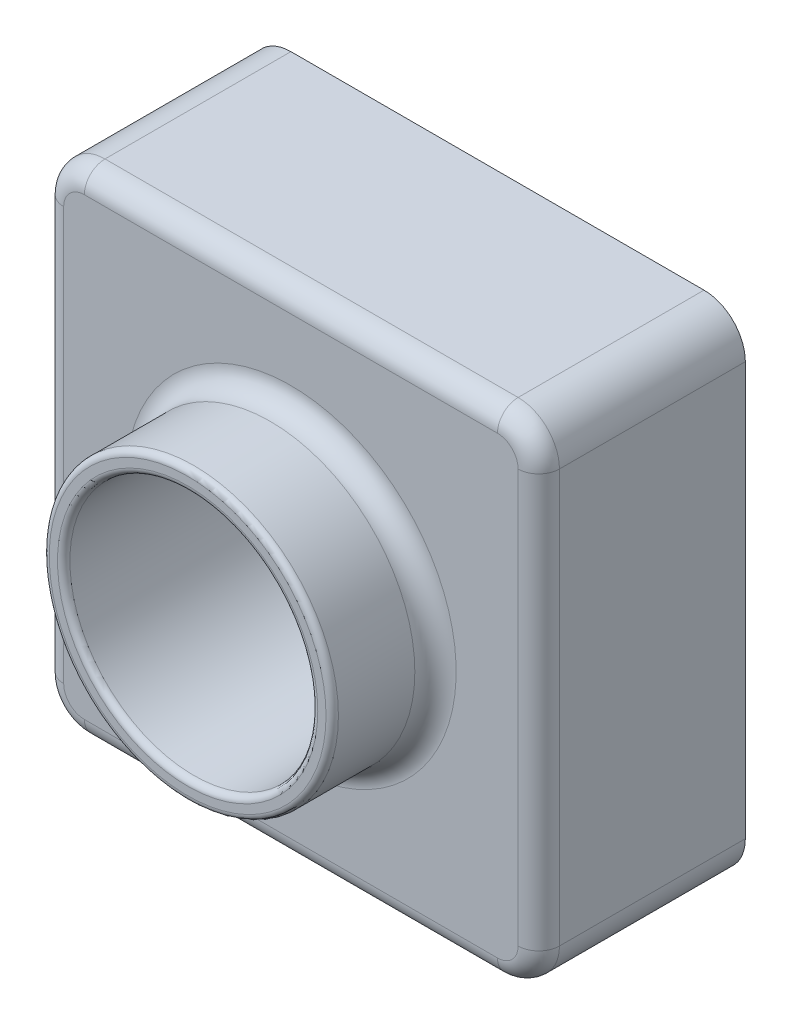
ISO-10303-21;
HEADER;
FILE_DESCRIPTION(('STEP AP214'),'2;1');
FILE_NAME('part.step','',(''),(''),'','','');
FILE_SCHEMA(('AUTOMOTIVE_DESIGN { 1 0 10303 214 1 1 1 1 }'));
ENDSEC;
DATA;
#1=APPLICATION_CONTEXT('core data for automotive mechanical design processes');
#2=APPLICATION_PROTOCOL_DEFINITION('international standard','automotive_design',2000,#1);
#3=PRODUCT_CONTEXT('',#1,'mechanical');
#4=PRODUCT('Part','Part','',(#3));
#5=PRODUCT_RELATED_PRODUCT_CATEGORY('part','',(#4));
#6=PRODUCT_DEFINITION_FORMATION('','',#4);
#7=PRODUCT_DEFINITION_CONTEXT('part definition',#1,'design');
#8=PRODUCT_DEFINITION('design','',#6,#7);
#9=PRODUCT_DEFINITION_SHAPE('','',#8);
#10=(LENGTH_UNIT() NAMED_UNIT(*) SI_UNIT(.MILLI.,.METRE.));
#11=(NAMED_UNIT(*) PLANE_ANGLE_UNIT() SI_UNIT($,.RADIAN.));
#12=(NAMED_UNIT(*) SI_UNIT($,.STERADIAN.) SOLID_ANGLE_UNIT());
#13=UNCERTAINTY_MEASURE_WITH_UNIT(LENGTH_MEASURE(1.E-05),#10,'distance_accuracy_value','');
#14=(GEOMETRIC_REPRESENTATION_CONTEXT(3) GLOBAL_UNCERTAINTY_ASSIGNED_CONTEXT((#13)) GLOBAL_UNIT_ASSIGNED_CONTEXT((#10,
#11,#12)) REPRESENTATION_CONTEXT('',''));
#15=CARTESIAN_POINT('',(0.,0.,0.));
#16=DIRECTION('',(0.,0.,1.));
#17=DIRECTION('',(1.,0.,0.));
#18=AXIS2_PLACEMENT_3D('',#15,#16,#17);
#19=CARTESIAN_POINT('',(-50.,-50.,0.));
#20=DIRECTION('',(0.,0.,-1.));
#21=DIRECTION('',(-1.,0.,0.));
#22=AXIS2_PLACEMENT_3D('',#19,#20,#21);
#23=PLANE('',#22);
#24=CARTESIAN_POINT('',(-50.,-50.,0.));
#25=DIRECTION('',(0.,0.,1.));
#26=DIRECTION('',(-1.,0.,0.));
#27=AXIS2_PLACEMENT_3D('',#24,#25,#26);
#28=CIRCLE('',#27,9.99999999999999);
#29=CARTESIAN_POINT('',(-60.,-49.9999999999999,0.));
#30=VERTEX_POINT('',#29);
#31=CARTESIAN_POINT('',(-49.9999999999999,-60.,0.));
#32=VERTEX_POINT('',#31);
#33=EDGE_CURVE('E200',#30,#32,#28,.T.);
#34=ORIENTED_EDGE('',*,*,#33,.F.);
#35=DIRECTION('',(0.,-1.,0.));
#36=VECTOR('',#35,1.);
#37=CARTESIAN_POINT('',(-60.,-49.9999999999999,0.));
#38=LINE('',#37,#36);
#39=CARTESIAN_POINT('',(-60.,49.9999999999999,0.));
#40=VERTEX_POINT('',#39);
#41=EDGE_CURVE('E267',#40,#30,#38,.T.);
#42=ORIENTED_EDGE('',*,*,#41,.F.);
#43=CARTESIAN_POINT('',(-50.,50.,0.));
#44=DIRECTION('',(0.,0.,1.));
#45=DIRECTION('',(-1.,0.,0.));
#46=AXIS2_PLACEMENT_3D('',#43,#44,#45);
#47=CIRCLE('',#46,10.);
#48=CARTESIAN_POINT('',(-49.9999999999999,60.,0.));
#49=VERTEX_POINT('',#48);
#50=EDGE_CURVE('E264',#49,#40,#47,.T.);
#51=ORIENTED_EDGE('',*,*,#50,.F.);
#52=DIRECTION('',(-1.,0.,0.));
#53=VECTOR('',#52,1.);
#54=CARTESIAN_POINT('',(-49.9999999999999,60.,0.));
#55=LINE('',#54,#53);
#56=CARTESIAN_POINT('',(49.9999999999999,60.,0.));
#57=VERTEX_POINT('',#56);
#58=EDGE_CURVE('E261',#57,#49,#55,.T.);
#59=ORIENTED_EDGE('',*,*,#58,.F.);
#60=CARTESIAN_POINT('',(50.,50.,0.));
#61=DIRECTION('',(0.,0.,1.));
#62=DIRECTION('',(-1.,0.,0.));
#63=AXIS2_PLACEMENT_3D('',#60,#61,#62);
#64=CIRCLE('',#63,10.);
#65=CARTESIAN_POINT('',(60.,49.9999999999999,0.));
#66=VERTEX_POINT('',#65);
#67=EDGE_CURVE('E258',#66,#57,#64,.T.);
#68=ORIENTED_EDGE('',*,*,#67,.F.);
#69=DIRECTION('',(0.,1.,0.));
#70=VECTOR('',#69,1.);
#71=CARTESIAN_POINT('',(60.,-49.9999999999999,0.));
#72=LINE('',#71,#70);
#73=CARTESIAN_POINT('',(60.,-50.,0.));
#74=VERTEX_POINT('',#73);
#75=EDGE_CURVE('E255',#74,#66,#72,.T.);
#76=ORIENTED_EDGE('',*,*,#75,.F.);
#77=CARTESIAN_POINT('',(50.,-50.,0.));
#78=DIRECTION('',(0.,0.,1.));
#79=DIRECTION('',(1.,0.,0.));
#80=AXIS2_PLACEMENT_3D('',#77,#78,#79);
#81=CIRCLE('',#80,9.99999999999999);
#82=CARTESIAN_POINT('',(49.9999999999999,-60.,0.));
#83=VERTEX_POINT('',#82);
#84=EDGE_CURVE('E252',#83,#74,#81,.T.);
#85=ORIENTED_EDGE('',*,*,#84,.F.);
#86=DIRECTION('',(1.,0.,0.));
#87=VECTOR('',#86,1.);
#88=CARTESIAN_POINT('',(-49.9999999999999,-60.,0.));
#89=LINE('',#88,#87);
#90=EDGE_CURVE('E204',#32,#83,#89,.T.);
#91=ORIENTED_EDGE('',*,*,#90,.F.);
#92=EDGE_LOOP('',(#34,#42,#51,#59,#68,#76,#85,#91));
#93=FACE_BOUND('',#92,.T.);
#94=DIRECTION('',(0.,-1.,0.));
#95=VECTOR('',#94,1.);
#96=CARTESIAN_POINT('',(-58.,-50.,0.));
#97=LINE('',#96,#95);
#98=CARTESIAN_POINT('',(-58.,49.9999999999999,0.));
#99=VERTEX_POINT('',#98);
#100=CARTESIAN_POINT('',(-58.,-49.9999999999999,0.));
#101=VERTEX_POINT('',#100);
#102=EDGE_CURVE('E195',#99,#101,#97,.T.);
#103=ORIENTED_EDGE('',*,*,#102,.T.);
#104=CARTESIAN_POINT('',(-50.,-50.,0.));
#105=DIRECTION('',(0.,0.,-1.));
#106=DIRECTION('',(-1.,0.,0.));
#107=AXIS2_PLACEMENT_3D('',#104,#105,#106);
#108=CIRCLE('',#107,7.99999999999999);
#109=CARTESIAN_POINT('',(-49.9999999999999,-58.,0.));
#110=VERTEX_POINT('',#109);
#111=EDGE_CURVE('E230',#101,#110,#108,.F.);
#112=ORIENTED_EDGE('',*,*,#111,.T.);
#113=DIRECTION('',(1.,0.,0.));
#114=VECTOR('',#113,1.);
#115=CARTESIAN_POINT('',(-50.,-58.,0.));
#116=LINE('',#115,#114);
#117=CARTESIAN_POINT('',(49.9999999999999,-58.,0.));
#118=VERTEX_POINT('',#117);
#119=EDGE_CURVE('E199',#110,#118,#116,.T.);
#120=ORIENTED_EDGE('',*,*,#119,.T.);
#121=CARTESIAN_POINT('',(50.,-50.,0.));
#122=DIRECTION('',(0.,0.,-1.));
#123=DIRECTION('',(-1.,0.,0.));
#124=AXIS2_PLACEMENT_3D('',#121,#122,#123);
#125=CIRCLE('',#124,7.99999999999999);
#126=CARTESIAN_POINT('',(58.,-50.,0.));
#127=VERTEX_POINT('',#126);
#128=EDGE_CURVE('E246',#118,#127,#125,.F.);
#129=ORIENTED_EDGE('',*,*,#128,.T.);
#130=DIRECTION('',(0.,1.,0.));
#131=VECTOR('',#130,1.);
#132=CARTESIAN_POINT('',(58.,-50.,0.));
#133=LINE('',#132,#131);
#134=CARTESIAN_POINT('',(58.,49.9999999999999,0.));
#135=VERTEX_POINT('',#134);
#136=EDGE_CURVE('E243',#127,#135,#133,.T.);
#137=ORIENTED_EDGE('',*,*,#136,.T.);
#138=CARTESIAN_POINT('',(50.,50.,0.));
#139=DIRECTION('',(0.,0.,-1.));
#140=DIRECTION('',(-1.,0.,0.));
#141=AXIS2_PLACEMENT_3D('',#138,#139,#140);
#142=CIRCLE('',#141,8.);
#143=CARTESIAN_POINT('',(49.9999999999999,58.,0.));
#144=VERTEX_POINT('',#143);
#145=EDGE_CURVE('E240',#135,#144,#142,.F.);
#146=ORIENTED_EDGE('',*,*,#145,.T.);
#147=DIRECTION('',(-1.,0.,0.));
#148=VECTOR('',#147,1.);
#149=CARTESIAN_POINT('',(-50.,58.,0.));
#150=LINE('',#149,#148);
#151=CARTESIAN_POINT('',(-49.9999999999999,58.,0.));
#152=VERTEX_POINT('',#151);
#153=EDGE_CURVE('E237',#144,#152,#150,.T.);
#154=ORIENTED_EDGE('',*,*,#153,.T.);
#155=CARTESIAN_POINT('',(-50.,50.,0.));
#156=DIRECTION('',(0.,0.,-1.));
#157=DIRECTION('',(-1.,0.,0.));
#158=AXIS2_PLACEMENT_3D('',#155,#156,#157);
#159=CIRCLE('',#158,8.);
#160=EDGE_CURVE('E234',#152,#99,#159,.F.);
#161=ORIENTED_EDGE('',*,*,#160,.T.);
#162=EDGE_LOOP('',(#103,#112,#120,#129,#137,#146,#154,#161));
#163=FACE_BOUND('',#162,.T.);
#164=ADVANCED_FACE('F37',(#93,#163),#23,.T.);
#165=CARTESIAN_POINT('',(-50.,-50.,50.));
#166=DIRECTION('',(0.,0.,-1.));
#167=DIRECTION('',(-1.,0.,0.));
#168=AXIS2_PLACEMENT_3D('',#165,#166,#167);
#169=CYLINDRICAL_SURFACE('',#168,9.99999999999999);
#170=DIRECTION('',(0.,0.,-1.));
#171=VECTOR('',#170,1.);
#172=CARTESIAN_POINT('',(-49.9999999999999,-60.,50.));
#173=LINE('',#172,#171);
#174=CARTESIAN_POINT('',(-49.9999999999999,-60.,45.));
#175=VERTEX_POINT('',#174);
#176=EDGE_CURVE('E284',#175,#32,#173,.T.);
#177=ORIENTED_EDGE('',*,*,#176,.F.);
#178=CARTESIAN_POINT('',(-50.,-50.,45.));
#179=DIRECTION('',(0.,0.,-1.));
#180=DIRECTION('',(-1.,0.,0.));
#181=AXIS2_PLACEMENT_3D('',#178,#179,#180);
#182=CIRCLE('',#181,9.99999999999999);
#183=CARTESIAN_POINT('',(-60.,-49.9999999999999,45.));
#184=VERTEX_POINT('',#183);
#185=EDGE_CURVE('E11',#175,#184,#182,.T.);
#186=ORIENTED_EDGE('',*,*,#185,.T.);
#187=DIRECTION('',(0.,0.,-1.));
#188=VECTOR('',#187,1.);
#189=CARTESIAN_POINT('',(-60.,-49.9999999999999,50.));
#190=LINE('',#189,#188);
#191=EDGE_CURVE('E270',#184,#30,#190,.T.);
#192=ORIENTED_EDGE('',*,*,#191,.T.);
#193=ORIENTED_EDGE('',*,*,#33,.T.);
#194=EDGE_LOOP('',(#177,#186,#192,#193));
#195=FACE_BOUND('',#194,.T.);
#196=ADVANCED_FACE('F428',(#195),#169,.T.);
#197=CARTESIAN_POINT('',(-49.9999999999999,-60.,50.));
#198=DIRECTION('',(0.,1.,0.));
#199=DIRECTION('',(0.,0.,1.));
#200=AXIS2_PLACEMENT_3D('',#197,#198,#199);
#201=PLANE('',#200);
#202=DIRECTION('',(0.,0.,-1.));
#203=VECTOR('',#202,1.);
#204=CARTESIAN_POINT('',(49.9999999999999,-60.,50.));
#205=LINE('',#204,#203);
#206=CARTESIAN_POINT('',(49.9999999999999,-60.,45.));
#207=VERTEX_POINT('',#206);
#208=EDGE_CURVE('E282',#207,#83,#205,.T.);
#209=ORIENTED_EDGE('',*,*,#208,.F.);
#210=DIRECTION('',(1.,0.,0.));
#211=VECTOR('',#210,1.);
#212=CARTESIAN_POINT('',(-49.9999999999999,-60.,45.));
#213=LINE('',#212,#211);
#214=EDGE_CURVE('E46',#207,#175,#213,.F.);
#215=ORIENTED_EDGE('',*,*,#214,.T.);
#216=ORIENTED_EDGE('',*,*,#176,.T.);
#217=ORIENTED_EDGE('',*,*,#90,.T.);
#218=EDGE_LOOP('',(#209,#215,#216,#217));
#219=FACE_BOUND('',#218,.T.);
#220=ADVANCED_FACE('F448',(#219),#201,.F.);
#221=CARTESIAN_POINT('',(50.,-50.,50.));
#222=DIRECTION('',(0.,0.,-1.));
#223=DIRECTION('',(-1.,0.,0.));
#224=AXIS2_PLACEMENT_3D('',#221,#222,#223);
#225=CYLINDRICAL_SURFACE('',#224,9.99999999999999);
#226=DIRECTION('',(0.,0.,-1.));
#227=VECTOR('',#226,1.);
#228=CARTESIAN_POINT('',(60.,-50.,50.));
#229=LINE('',#228,#227);
#230=CARTESIAN_POINT('',(60.,-50.,45.));
#231=VERTEX_POINT('',#230);
#232=EDGE_CURVE('E280',#231,#74,#229,.T.);
#233=ORIENTED_EDGE('',*,*,#232,.F.);
#234=CARTESIAN_POINT('',(50.,-50.,45.));
#235=DIRECTION('',(0.,0.,-1.));
#236=DIRECTION('',(-1.,0.,0.));
#237=AXIS2_PLACEMENT_3D('',#234,#235,#236);
#238=CIRCLE('',#237,9.99999999999999);
#239=EDGE_CURVE('E61',#231,#207,#238,.T.);
#240=ORIENTED_EDGE('',*,*,#239,.T.);
#241=ORIENTED_EDGE('',*,*,#208,.T.);
#242=ORIENTED_EDGE('',*,*,#84,.T.);
#243=EDGE_LOOP('',(#233,#240,#241,#242));
#244=FACE_BOUND('',#243,.T.);
#245=ADVANCED_FACE('F385',(#244),#225,.T.);
#246=CARTESIAN_POINT('',(60.,-49.9999999999999,50.));
#247=DIRECTION('',(-1.,0.,0.));
#248=DIRECTION('',(0.,0.,1.));
#249=AXIS2_PLACEMENT_3D('',#246,#247,#248);
#250=PLANE('',#249);
#251=DIRECTION('',(0.,0.,-1.));
#252=VECTOR('',#251,1.);
#253=CARTESIAN_POINT('',(60.,49.9999999999999,50.));
#254=LINE('',#253,#252);
#255=CARTESIAN_POINT('',(60.,49.9999999999999,45.));
#256=VERTEX_POINT('',#255);
#257=EDGE_CURVE('E278',#256,#66,#254,.T.);
#258=ORIENTED_EDGE('',*,*,#257,.F.);
#259=DIRECTION('',(0.,1.,0.));
#260=VECTOR('',#259,1.);
#261=CARTESIAN_POINT('',(60.,-49.9999999999999,45.));
#262=LINE('',#261,#260);
#263=EDGE_CURVE('E348',#256,#231,#262,.F.);
#264=ORIENTED_EDGE('',*,*,#263,.T.);
#265=ORIENTED_EDGE('',*,*,#232,.T.);
#266=ORIENTED_EDGE('',*,*,#75,.T.);
#267=EDGE_LOOP('',(#258,#264,#265,#266));
#268=FACE_BOUND('',#267,.T.);
#269=ADVANCED_FACE('F384',(#268),#250,.F.);
#270=CARTESIAN_POINT('',(50.,50.,50.));
#271=DIRECTION('',(0.,0.,-1.));
#272=DIRECTION('',(-1.,0.,0.));
#273=AXIS2_PLACEMENT_3D('',#270,#271,#272);
#274=CYLINDRICAL_SURFACE('',#273,10.);
#275=DIRECTION('',(0.,0.,-1.));
#276=VECTOR('',#275,1.);
#277=CARTESIAN_POINT('',(49.9999999999999,60.,50.));
#278=LINE('',#277,#276);
#279=CARTESIAN_POINT('',(49.9999999999999,60.,45.));
#280=VERTEX_POINT('',#279);
#281=EDGE_CURVE('E276',#280,#57,#278,.T.);
#282=ORIENTED_EDGE('',*,*,#281,.F.);
#283=CARTESIAN_POINT('',(50.,50.,45.));
#284=DIRECTION('',(0.,0.,-1.));
#285=DIRECTION('',(-1.,0.,0.));
#286=AXIS2_PLACEMENT_3D('',#283,#284,#285);
#287=CIRCLE('',#286,10.);
#288=EDGE_CURVE('E346',#280,#256,#287,.T.);
#289=ORIENTED_EDGE('',*,*,#288,.T.);
#290=ORIENTED_EDGE('',*,*,#257,.T.);
#291=ORIENTED_EDGE('',*,*,#67,.T.);
#292=EDGE_LOOP('',(#282,#289,#290,#291));
#293=FACE_BOUND('',#292,.T.);
#294=ADVANCED_FACE('F397',(#293),#274,.T.);
#295=CARTESIAN_POINT('',(-49.9999999999999,60.,50.));
#296=DIRECTION('',(0.,-1.,0.));
#297=DIRECTION('',(0.,0.,-1.));
#298=AXIS2_PLACEMENT_3D('',#295,#296,#297);
#299=PLANE('',#298);
#300=DIRECTION('',(0.,0.,-1.));
#301=VECTOR('',#300,1.);
#302=CARTESIAN_POINT('',(-49.9999999999999,60.,50.));
#303=LINE('',#302,#301);
#304=CARTESIAN_POINT('',(-49.9999999999999,60.,45.));
#305=VERTEX_POINT('',#304);
#306=EDGE_CURVE('E274',#305,#49,#303,.T.);
#307=ORIENTED_EDGE('',*,*,#306,.F.);
#308=DIRECTION('',(-1.,0.,0.));
#309=VECTOR('',#308,1.);
#310=CARTESIAN_POINT('',(-49.9999999999999,60.,45.));
#311=LINE('',#310,#309);
#312=EDGE_CURVE('E344',#305,#280,#311,.F.);
#313=ORIENTED_EDGE('',*,*,#312,.T.);
#314=ORIENTED_EDGE('',*,*,#281,.T.);
#315=ORIENTED_EDGE('',*,*,#58,.T.);
#316=EDGE_LOOP('',(#307,#313,#314,#315));
#317=FACE_BOUND('',#316,.T.);
#318=ADVANCED_FACE('F400',(#317),#299,.F.);
#319=CARTESIAN_POINT('',(-50.,50.,50.));
#320=DIRECTION('',(0.,0.,-1.));
#321=DIRECTION('',(-1.,0.,0.));
#322=AXIS2_PLACEMENT_3D('',#319,#320,#321);
#323=CYLINDRICAL_SURFACE('',#322,10.);
#324=DIRECTION('',(0.,0.,-1.));
#325=VECTOR('',#324,1.);
#326=CARTESIAN_POINT('',(-60.,49.9999999999999,50.));
#327=LINE('',#326,#325);
#328=CARTESIAN_POINT('',(-60.,49.9999999999999,45.));
#329=VERTEX_POINT('',#328);
#330=EDGE_CURVE('E272',#329,#40,#327,.T.);
#331=ORIENTED_EDGE('',*,*,#330,.F.);
#332=CARTESIAN_POINT('',(-50.,50.,45.));
#333=DIRECTION('',(0.,0.,-1.));
#334=DIRECTION('',(-1.,0.,0.));
#335=AXIS2_PLACEMENT_3D('',#332,#333,#334);
#336=CIRCLE('',#335,10.);
#337=EDGE_CURVE('E342',#329,#305,#336,.T.);
#338=ORIENTED_EDGE('',*,*,#337,.T.);
#339=ORIENTED_EDGE('',*,*,#306,.T.);
#340=ORIENTED_EDGE('',*,*,#50,.T.);
#341=EDGE_LOOP('',(#331,#338,#339,#340));
#342=FACE_BOUND('',#341,.T.);
#343=ADVANCED_FACE('F455',(#342),#323,.T.);
#344=CARTESIAN_POINT('',(-60.,-49.9999999999999,50.));
#345=DIRECTION('',(1.,0.,0.));
#346=DIRECTION('',(0.,0.,-1.));
#347=AXIS2_PLACEMENT_3D('',#344,#345,#346);
#348=PLANE('',#347);
#349=ORIENTED_EDGE('',*,*,#191,.F.);
#350=DIRECTION('',(0.,-1.,0.));
#351=VECTOR('',#350,1.);
#352=CARTESIAN_POINT('',(-60.,-49.9999999999999,45.));
#353=LINE('',#352,#351);
#354=EDGE_CURVE('E339',#184,#329,#353,.F.);
#355=ORIENTED_EDGE('',*,*,#354,.T.);
#356=ORIENTED_EDGE('',*,*,#330,.T.);
#357=ORIENTED_EDGE('',*,*,#41,.T.);
#358=EDGE_LOOP('',(#349,#355,#356,#357));
#359=FACE_BOUND('',#358,.T.);
#360=ADVANCED_FACE('F431',(#359),#348,.F.);
#361=CARTESIAN_POINT('',(-50.,-50.,50.));
#362=DIRECTION('',(0.,0.,-1.));
#363=DIRECTION('',(-1.,0.,0.));
#364=AXIS2_PLACEMENT_3D('',#361,#362,#363);
#365=PLANE('',#364);
#366=CARTESIAN_POINT('',(-50.,50.,50.));
#367=DIRECTION('',(0.,0.,-1.));
#368=DIRECTION('',(-1.,0.,0.));
#369=AXIS2_PLACEMENT_3D('',#366,#367,#368);
#370=CIRCLE('',#369,5.);
#371=CARTESIAN_POINT('',(-50.,55.,50.));
#372=VERTEX_POINT('',#371);
#373=CARTESIAN_POINT('',(-55.,49.9999999999999,50.));
#374=VERTEX_POINT('',#373);
#375=EDGE_CURVE('E334',#372,#374,#370,.F.);
#376=ORIENTED_EDGE('',*,*,#375,.T.);
#377=DIRECTION('',(0.,-1.,0.));
#378=VECTOR('',#377,1.);
#379=CARTESIAN_POINT('',(-55.,-50.,50.));
#380=LINE('',#379,#378);
#381=CARTESIAN_POINT('',(-55.,-49.9999999999999,50.));
#382=VERTEX_POINT('',#381);
#383=EDGE_CURVE('E336',#374,#382,#380,.T.);
#384=ORIENTED_EDGE('',*,*,#383,.T.);
#385=CARTESIAN_POINT('',(-50.,-50.,50.));
#386=DIRECTION('',(0.,0.,-1.));
#387=DIRECTION('',(-1.,0.,0.));
#388=AXIS2_PLACEMENT_3D('',#385,#386,#387);
#389=CIRCLE('',#388,4.99999999999999);
#390=CARTESIAN_POINT('',(-49.9999999999999,-55.,50.));
#391=VERTEX_POINT('',#390);
#392=EDGE_CURVE('E322',#382,#391,#389,.F.);
#393=ORIENTED_EDGE('',*,*,#392,.T.);
#394=DIRECTION('',(1.,0.,0.));
#395=VECTOR('',#394,1.);
#396=CARTESIAN_POINT('',(-50.,-55.,50.));
#397=LINE('',#396,#395);
#398=CARTESIAN_POINT('',(50.,-55.,50.));
#399=VERTEX_POINT('',#398);
#400=EDGE_CURVE('E324',#391,#399,#397,.T.);
#401=ORIENTED_EDGE('',*,*,#400,.T.);
#402=CARTESIAN_POINT('',(50.,-50.,50.));
#403=DIRECTION('',(0.,0.,-1.));
#404=DIRECTION('',(-1.,0.,0.));
#405=AXIS2_PLACEMENT_3D('',#402,#403,#404);
#406=CIRCLE('',#405,4.99999999999999);
#407=CARTESIAN_POINT('',(55.,-50.,50.));
#408=VERTEX_POINT('',#407);
#409=EDGE_CURVE('E326',#399,#408,#406,.F.);
#410=ORIENTED_EDGE('',*,*,#409,.T.);
#411=DIRECTION('',(0.,1.,0.));
#412=VECTOR('',#411,1.);
#413=CARTESIAN_POINT('',(55.,-50.,50.));
#414=LINE('',#413,#412);
#415=CARTESIAN_POINT('',(55.,50.,50.));
#416=VERTEX_POINT('',#415);
#417=EDGE_CURVE('E328',#408,#416,#414,.T.);
#418=ORIENTED_EDGE('',*,*,#417,.T.);
#419=CARTESIAN_POINT('',(50.,50.,50.));
#420=DIRECTION('',(0.,0.,-1.));
#421=DIRECTION('',(-1.,0.,0.));
#422=AXIS2_PLACEMENT_3D('',#419,#420,#421);
#423=CIRCLE('',#422,5.);
#424=CARTESIAN_POINT('',(49.9999999999999,55.,50.));
#425=VERTEX_POINT('',#424);
#426=EDGE_CURVE('E330',#416,#425,#423,.F.);
#427=ORIENTED_EDGE('',*,*,#426,.T.);
#428=DIRECTION('',(-1.,0.,0.));
#429=VECTOR('',#428,1.);
#430=CARTESIAN_POINT('',(-50.,55.,50.));
#431=LINE('',#430,#429);
#432=EDGE_CURVE('E332',#425,#372,#431,.T.);
#433=ORIENTED_EDGE('',*,*,#432,.T.);
#434=EDGE_LOOP('',(#376,#384,#393,#401,#410,#418,#427,#433));
#435=FACE_BOUND('',#434,.T.);
#436=CARTESIAN_POINT('',(0.,0.,50.));
#437=DIRECTION('',(0.,0.,-1.));
#438=DIRECTION('',(-1.,0.,0.));
#439=AXIS2_PLACEMENT_3D('',#436,#437,#438);
#440=CIRCLE('',#439,40.);
#441=CARTESIAN_POINT('',(-40.,0.,50.));
#442=VERTEX_POINT('',#441);
#443=EDGE_CURVE('E316',#442,#442,#440,.T.);
#444=ORIENTED_EDGE('',*,*,#443,.T.);
#445=EDGE_LOOP('',(#444));
#446=FACE_BOUND('',#445,.T.);
#447=ADVANCED_FACE('F413',(#435,#446),#365,.F.);
#448=CARTESIAN_POINT('',(-50.,-50.,50.));
#449=DIRECTION('',(0.,0.,-1.));
#450=DIRECTION('',(-1.,0.,0.));
#451=AXIS2_PLACEMENT_3D('',#448,#449,#450);
#452=CYLINDRICAL_SURFACE('',#451,7.99999999999999);
#453=ORIENTED_EDGE('',*,*,#111,.F.);
#454=DIRECTION('',(0.,0.,-1.));
#455=VECTOR('',#454,1.);
#456=CARTESIAN_POINT('',(-58.,-49.9999999999999,50.));
#457=LINE('',#456,#455);
#458=CARTESIAN_POINT('',(-58.,-49.9999999999999,48.));
#459=VERTEX_POINT('',#458);
#460=EDGE_CURVE('E194',#459,#101,#457,.T.);
#461=ORIENTED_EDGE('',*,*,#460,.F.);
#462=CARTESIAN_POINT('',(-50.,-50.,48.));
#463=DIRECTION('',(0.,0.,-1.));
#464=DIRECTION('',(-1.,0.,0.));
#465=AXIS2_PLACEMENT_3D('',#462,#463,#464);
#466=CIRCLE('',#465,7.99999999999999);
#467=CARTESIAN_POINT('',(-49.9999999999999,-58.,48.));
#468=VERTEX_POINT('',#467);
#469=EDGE_CURVE('E179',#459,#468,#466,.F.);
#470=ORIENTED_EDGE('',*,*,#469,.T.);
#471=DIRECTION('',(0.,0.,1.));
#472=VECTOR('',#471,1.);
#473=CARTESIAN_POINT('',(-49.9999999999999,-58.,50.));
#474=LINE('',#473,#472);
#475=EDGE_CURVE('E192',#468,#110,#474,.F.);
#476=ORIENTED_EDGE('',*,*,#475,.T.);
#477=EDGE_LOOP('',(#453,#461,#470,#476));
#478=FACE_BOUND('',#477,.T.);
#479=ADVANCED_FACE('F191',(#478),#452,.F.);
#480=CARTESIAN_POINT('',(-49.9999999999999,-58.,50.));
#481=DIRECTION('',(0.,1.,0.));
#482=DIRECTION('',(0.,0.,1.));
#483=AXIS2_PLACEMENT_3D('',#480,#481,#482);
#484=PLANE('',#483);
#485=ORIENTED_EDGE('',*,*,#119,.F.);
#486=ORIENTED_EDGE('',*,*,#475,.F.);
#487=DIRECTION('',(1.,0.,0.));
#488=VECTOR('',#487,1.);
#489=CARTESIAN_POINT('',(-50.,-58.,48.));
#490=LINE('',#489,#488);
#491=CARTESIAN_POINT('',(50.,-58.,48.));
#492=VERTEX_POINT('',#491);
#493=EDGE_CURVE('E175',#468,#492,#490,.T.);
#494=ORIENTED_EDGE('',*,*,#493,.T.);
#495=DIRECTION('',(0.,0.,-1.));
#496=VECTOR('',#495,1.);
#497=CARTESIAN_POINT('',(50.,-58.,50.));
#498=LINE('',#497,#496);
#499=EDGE_CURVE('E201',#492,#118,#498,.T.);
#500=ORIENTED_EDGE('',*,*,#499,.T.);
#501=EDGE_LOOP('',(#485,#486,#494,#500));
#502=FACE_BOUND('',#501,.T.);
#503=ADVANCED_FACE('F197',(#502),#484,.T.);
#504=CARTESIAN_POINT('',(50.,-50.,50.));
#505=DIRECTION('',(0.,0.,-1.));
#506=DIRECTION('',(-1.,0.,0.));
#507=AXIS2_PLACEMENT_3D('',#504,#505,#506);
#508=CYLINDRICAL_SURFACE('',#507,7.99999999999999);
#509=ORIENTED_EDGE('',*,*,#128,.F.);
#510=ORIENTED_EDGE('',*,*,#499,.F.);
#511=CARTESIAN_POINT('',(50.,-50.,48.));
#512=DIRECTION('',(0.,0.,-1.));
#513=DIRECTION('',(-1.,0.,0.));
#514=AXIS2_PLACEMENT_3D('',#511,#512,#513);
#515=CIRCLE('',#514,7.99999999999999);
#516=CARTESIAN_POINT('',(58.,-50.,48.));
#517=VERTEX_POINT('',#516);
#518=EDGE_CURVE('E181',#492,#517,#515,.F.);
#519=ORIENTED_EDGE('',*,*,#518,.T.);
#520=DIRECTION('',(0.,0.,1.));
#521=VECTOR('',#520,1.);
#522=CARTESIAN_POINT('',(58.,-50.,50.));
#523=LINE('',#522,#521);
#524=EDGE_CURVE('E206',#517,#127,#523,.F.);
#525=ORIENTED_EDGE('',*,*,#524,.T.);
#526=EDGE_LOOP('',(#509,#510,#519,#525));
#527=FACE_BOUND('',#526,.T.);
#528=ADVANCED_FACE('F506',(#527),#508,.F.);
#529=CARTESIAN_POINT('',(58.,-49.9999999999999,50.));
#530=DIRECTION('',(-1.,0.,0.));
#531=DIRECTION('',(0.,0.,1.));
#532=AXIS2_PLACEMENT_3D('',#529,#530,#531);
#533=PLANE('',#532);
#534=ORIENTED_EDGE('',*,*,#136,.F.);
#535=ORIENTED_EDGE('',*,*,#524,.F.);
#536=DIRECTION('',(0.,1.,0.));
#537=VECTOR('',#536,1.);
#538=CARTESIAN_POINT('',(58.,-50.,48.));
#539=LINE('',#538,#537);
#540=CARTESIAN_POINT('',(58.,49.9999999999999,48.));
#541=VERTEX_POINT('',#540);
#542=EDGE_CURVE('E215',#517,#541,#539,.T.);
#543=ORIENTED_EDGE('',*,*,#542,.T.);
#544=DIRECTION('',(0.,0.,-1.));
#545=VECTOR('',#544,1.);
#546=CARTESIAN_POINT('',(58.,49.9999999999999,50.));
#547=LINE('',#546,#545);
#548=EDGE_CURVE('E213',#541,#135,#547,.T.);
#549=ORIENTED_EDGE('',*,*,#548,.T.);
#550=EDGE_LOOP('',(#534,#535,#543,#549));
#551=FACE_BOUND('',#550,.T.);
#552=ADVANCED_FACE('F514',(#551),#533,.T.);
#553=CARTESIAN_POINT('',(50.,50.,50.));
#554=DIRECTION('',(0.,0.,-1.));
#555=DIRECTION('',(-1.,0.,0.));
#556=AXIS2_PLACEMENT_3D('',#553,#554,#555);
#557=CYLINDRICAL_SURFACE('',#556,8.);
#558=ORIENTED_EDGE('',*,*,#145,.F.);
#559=ORIENTED_EDGE('',*,*,#548,.F.);
#560=CARTESIAN_POINT('',(50.,50.,48.));
#561=DIRECTION('',(0.,0.,-1.));
#562=DIRECTION('',(-1.,0.,0.));
#563=AXIS2_PLACEMENT_3D('',#560,#561,#562);
#564=CIRCLE('',#563,8.);
#565=CARTESIAN_POINT('',(49.9999999999999,58.,48.));
#566=VERTEX_POINT('',#565);
#567=EDGE_CURVE('E219',#541,#566,#564,.F.);
#568=ORIENTED_EDGE('',*,*,#567,.T.);
#569=DIRECTION('',(0.,0.,-1.));
#570=VECTOR('',#569,1.);
#571=CARTESIAN_POINT('',(49.9999999999999,58.,50.));
#572=LINE('',#571,#570);
#573=EDGE_CURVE('E217',#566,#144,#572,.T.);
#574=ORIENTED_EDGE('',*,*,#573,.T.);
#575=EDGE_LOOP('',(#558,#559,#568,#574));
#576=FACE_BOUND('',#575,.T.);
#577=ADVANCED_FACE('F518',(#576),#557,.F.);
#578=CARTESIAN_POINT('',(-49.9999999999999,58.,50.));
#579=DIRECTION('',(0.,-1.,0.));
#580=DIRECTION('',(0.,0.,-1.));
#581=AXIS2_PLACEMENT_3D('',#578,#579,#580);
#582=PLANE('',#581);
#583=ORIENTED_EDGE('',*,*,#153,.F.);
#584=ORIENTED_EDGE('',*,*,#573,.F.);
#585=DIRECTION('',(-1.,0.,0.));
#586=VECTOR('',#585,1.);
#587=CARTESIAN_POINT('',(-50.,58.,48.));
#588=LINE('',#587,#586);
#589=CARTESIAN_POINT('',(-49.9999999999999,58.,48.));
#590=VERTEX_POINT('',#589);
#591=EDGE_CURVE('E223',#566,#590,#588,.T.);
#592=ORIENTED_EDGE('',*,*,#591,.T.);
#593=DIRECTION('',(0.,0.,-1.));
#594=VECTOR('',#593,1.);
#595=CARTESIAN_POINT('',(-49.9999999999999,58.,50.));
#596=LINE('',#595,#594);
#597=EDGE_CURVE('E221',#590,#152,#596,.T.);
#598=ORIENTED_EDGE('',*,*,#597,.T.);
#599=EDGE_LOOP('',(#583,#584,#592,#598));
#600=FACE_BOUND('',#599,.T.);
#601=ADVANCED_FACE('F522',(#600),#582,.T.);
#602=CARTESIAN_POINT('',(-50.,50.,50.));
#603=DIRECTION('',(0.,0.,-1.));
#604=DIRECTION('',(-1.,0.,0.));
#605=AXIS2_PLACEMENT_3D('',#602,#603,#604);
#606=CYLINDRICAL_SURFACE('',#605,8.);
#607=ORIENTED_EDGE('',*,*,#160,.F.);
#608=ORIENTED_EDGE('',*,*,#597,.F.);
#609=CARTESIAN_POINT('',(-50.,50.,48.));
#610=DIRECTION('',(0.,0.,-1.));
#611=DIRECTION('',(-1.,0.,0.));
#612=AXIS2_PLACEMENT_3D('',#609,#610,#611);
#613=CIRCLE('',#612,8.);
#614=CARTESIAN_POINT('',(-58.,49.9999999999999,48.));
#615=VERTEX_POINT('',#614);
#616=EDGE_CURVE('E226',#590,#615,#613,.F.);
#617=ORIENTED_EDGE('',*,*,#616,.T.);
#618=DIRECTION('',(0.,0.,-1.));
#619=VECTOR('',#618,1.);
#620=CARTESIAN_POINT('',(-58.,49.9999999999999,50.));
#621=LINE('',#620,#619);
#622=EDGE_CURVE('E209',#615,#99,#621,.T.);
#623=ORIENTED_EDGE('',*,*,#622,.T.);
#624=EDGE_LOOP('',(#607,#608,#617,#623));
#625=FACE_BOUND('',#624,.T.);
#626=ADVANCED_FACE('F526',(#625),#606,.F.);
#627=CARTESIAN_POINT('',(-58.,-49.9999999999999,50.));
#628=DIRECTION('',(1.,0.,0.));
#629=DIRECTION('',(0.,0.,-1.));
#630=AXIS2_PLACEMENT_3D('',#627,#628,#629);
#631=PLANE('',#630);
#632=ORIENTED_EDGE('',*,*,#102,.F.);
#633=ORIENTED_EDGE('',*,*,#622,.F.);
#634=DIRECTION('',(0.,-1.,0.));
#635=VECTOR('',#634,1.);
#636=CARTESIAN_POINT('',(-58.,-50.,48.));
#637=LINE('',#636,#635);
#638=EDGE_CURVE('E210',#615,#459,#637,.T.);
#639=ORIENTED_EDGE('',*,*,#638,.T.);
#640=ORIENTED_EDGE('',*,*,#460,.T.);
#641=EDGE_LOOP('',(#632,#633,#639,#640));
#642=FACE_BOUND('',#641,.T.);
#643=ADVANCED_FACE('F530',(#642),#631,.T.);
#644=CARTESIAN_POINT('',(-50.,-50.,48.));
#645=DIRECTION('',(0.,0.,-1.));
#646=DIRECTION('',(-1.,0.,0.));
#647=AXIS2_PLACEMENT_3D('',#644,#645,#646);
#648=PLANE('',#647);
#649=CARTESIAN_POINT('',(0.,0.,48.));
#650=DIRECTION('',(0.,0.,-1.));
#651=DIRECTION('',(-1.,0.,0.));
#652=AXIS2_PLACEMENT_3D('',#649,#650,#651);
#653=CIRCLE('',#652,40.);
#654=CARTESIAN_POINT('',(-40.,0.,48.));
#655=VERTEX_POINT('',#654);
#656=EDGE_CURVE('E313',#655,#655,#653,.F.);
#657=ORIENTED_EDGE('',*,*,#656,.T.);
#658=EDGE_LOOP('',(#657));
#659=FACE_BOUND('',#658,.T.);
#660=ORIENTED_EDGE('',*,*,#469,.F.);
#661=ORIENTED_EDGE('',*,*,#638,.F.);
#662=ORIENTED_EDGE('',*,*,#616,.F.);
#663=ORIENTED_EDGE('',*,*,#591,.F.);
#664=ORIENTED_EDGE('',*,*,#567,.F.);
#665=ORIENTED_EDGE('',*,*,#542,.F.);
#666=ORIENTED_EDGE('',*,*,#518,.F.);
#667=ORIENTED_EDGE('',*,*,#493,.F.);
#668=EDGE_LOOP('',(#660,#661,#662,#663,#664,#665,#666,#667));
#669=FACE_BOUND('',#668,.T.);
#670=ADVANCED_FACE('F177',(#659,#669),#648,.T.);
#671=CARTESIAN_POINT('',(0.,0.,0.));
#672=DIRECTION('',(0.,0.,1.));
#673=DIRECTION('',(1.,0.,0.));
#674=AXIS2_PLACEMENT_3D('',#671,#672,#673);
#675=CYLINDRICAL_SURFACE('',#674,35.);
#676=CARTESIAN_POINT('',(0.,0.,43.));
#677=DIRECTION('',(0.,0.,-1.));
#678=DIRECTION('',(-1.,0.,0.));
#679=AXIS2_PLACEMENT_3D('',#676,#677,#678);
#680=CIRCLE('',#679,35.);
#681=CARTESIAN_POINT('',(-35.,0.,43.));
#682=VERTEX_POINT('',#681);
#683=EDGE_CURVE('E310',#682,#682,#680,.T.);
#684=ORIENTED_EDGE('',*,*,#683,.T.);
#685=EDGE_LOOP('',(#684));
#686=FACE_BOUND('',#685,.T.);
#687=CARTESIAN_POINT('',(0.,0.,1.5));
#688=DIRECTION('',(0.,0.,1.));
#689=DIRECTION('',(1.,0.,0.));
#690=AXIS2_PLACEMENT_3D('',#687,#688,#689);
#691=CIRCLE('',#690,35.);
#692=CARTESIAN_POINT('',(35.,0.,1.5));
#693=VERTEX_POINT('',#692);
#694=EDGE_CURVE('E286',#693,#693,#691,.T.);
#695=ORIENTED_EDGE('',*,*,#694,.T.);
#696=EDGE_LOOP('',(#695));
#697=FACE_BOUND('',#696,.T.);
#698=ADVANCED_FACE('F509',(#686,#697),#675,.T.);
#699=CARTESIAN_POINT('',(0.,0.,0.));
#700=DIRECTION('',(0.,0.,1.));
#701=DIRECTION('',(1.,0.,0.));
#702=AXIS2_PLACEMENT_3D('',#699,#700,#701);
#703=PLANE('',#702);
#704=CARTESIAN_POINT('',(0.,0.,0.));
#705=DIRECTION('',(0.,0.,1.));
#706=DIRECTION('',(1.,0.,0.));
#707=AXIS2_PLACEMENT_3D('',#704,#705,#706);
#708=CIRCLE('',#707,33.5);
#709=CARTESIAN_POINT('',(33.5,0.,0.));
#710=VERTEX_POINT('',#709);
#711=EDGE_CURVE('E292',#710,#710,#708,.F.);
#712=ORIENTED_EDGE('',*,*,#711,.T.);
#713=EDGE_LOOP('',(#712));
#714=FACE_BOUND('',#713,.T.);
#715=CARTESIAN_POINT('',(0.,0.,0.));
#716=DIRECTION('',(0.,0.,1.));
#717=DIRECTION('',(1.,0.,0.));
#718=AXIS2_PLACEMENT_3D('',#715,#716,#717);
#719=CIRCLE('',#718,31.5);
#720=CARTESIAN_POINT('',(31.5,0.,0.));
#721=VERTEX_POINT('',#720);
#722=EDGE_CURVE('E289',#721,#721,#719,.T.);
#723=ORIENTED_EDGE('',*,*,#722,.T.);
#724=EDGE_LOOP('',(#723));
#725=FACE_BOUND('',#724,.T.);
#726=ADVANCED_FACE('F539',(#714,#725),#703,.F.);
#727=CARTESIAN_POINT('',(0.,0.,55.));
#728=DIRECTION('',(0.,0.,-1.));
#729=DIRECTION('',(-1.,0.,0.));
#730=AXIS2_PLACEMENT_3D('',#727,#728,#729);
#731=CIRCLE('',#730,35.);
#732=CARTESIAN_POINT('',(-35.,0.,55.));
#733=VERTEX_POINT('',#732);
#734=EDGE_CURVE('E319',#733,#733,#731,.F.);
#735=ORIENTED_EDGE('',*,*,#734,.T.);
#736=EDGE_LOOP('',(#735));
#737=FACE_BOUND('',#736,.T.);
#738=CARTESIAN_POINT('',(0.,0.,73.5));
#739=DIRECTION('',(0.,0.,1.));
#740=DIRECTION('',(1.,0.,0.));
#741=AXIS2_PLACEMENT_3D('',#738,#739,#740);
#742=CIRCLE('',#741,35.);
#743=CARTESIAN_POINT('',(35.,0.,73.5));
#744=VERTEX_POINT('',#743);
#745=EDGE_CURVE('E307',#744,#744,#742,.F.);
#746=ORIENTED_EDGE('',*,*,#745,.T.);
#747=EDGE_LOOP('',(#746));
#748=FACE_BOUND('',#747,.T.);
#749=ADVANCED_FACE('F541',(#737,#748),#675,.T.);
#750=CARTESIAN_POINT('',(0.,0.,0.));
#751=DIRECTION('',(0.,0.,1.));
#752=DIRECTION('',(1.,0.,0.));
#753=AXIS2_PLACEMENT_3D('',#750,#751,#752);
#754=CYLINDRICAL_SURFACE('',#753,30.);
#755=CARTESIAN_POINT('',(0.,0.,1.5));
#756=DIRECTION('',(0.,0.,1.));
#757=DIRECTION('',(1.,0.,0.));
#758=AXIS2_PLACEMENT_3D('',#755,#756,#757);
#759=CIRCLE('',#758,30.);
#760=CARTESIAN_POINT('',(30.,0.,1.5));
#761=VERTEX_POINT('',#760);
#762=EDGE_CURVE('E298',#761,#761,#759,.F.);
#763=ORIENTED_EDGE('',*,*,#762,.T.);
#764=EDGE_LOOP('',(#763));
#765=FACE_BOUND('',#764,.T.);
#766=CARTESIAN_POINT('',(0.,0.,73.5));
#767=DIRECTION('',(0.,0.,1.));
#768=DIRECTION('',(1.,0.,0.));
#769=AXIS2_PLACEMENT_3D('',#766,#767,#768);
#770=CIRCLE('',#769,30.);
#771=CARTESIAN_POINT('',(30.,0.,73.5));
#772=VERTEX_POINT('',#771);
#773=EDGE_CURVE('E295',#772,#772,#770,.T.);
#774=ORIENTED_EDGE('',*,*,#773,.T.);
#775=EDGE_LOOP('',(#774));
#776=FACE_BOUND('',#775,.T.);
#777=ADVANCED_FACE('F553',(#765,#776),#754,.F.);
#778=CARTESIAN_POINT('',(0.,0.,75.));
#779=DIRECTION('',(0.,0.,1.));
#780=DIRECTION('',(1.,0.,0.));
#781=AXIS2_PLACEMENT_3D('',#778,#779,#780);
#782=PLANE('',#781);
#783=CARTESIAN_POINT('',(0.,0.,75.));
#784=DIRECTION('',(0.,0.,1.));
#785=DIRECTION('',(1.,0.,0.));
#786=AXIS2_PLACEMENT_3D('',#783,#784,#785);
#787=CIRCLE('',#786,31.5);
#788=CARTESIAN_POINT('',(31.5,0.,75.));
#789=VERTEX_POINT('',#788);
#790=EDGE_CURVE('E304',#789,#789,#787,.F.);
#791=ORIENTED_EDGE('',*,*,#790,.T.);
#792=EDGE_LOOP('',(#791));
#793=FACE_BOUND('',#792,.T.);
#794=CARTESIAN_POINT('',(0.,0.,75.));
#795=DIRECTION('',(0.,0.,1.));
#796=DIRECTION('',(1.,0.,0.));
#797=AXIS2_PLACEMENT_3D('',#794,#795,#796);
#798=CIRCLE('',#797,33.5);
#799=CARTESIAN_POINT('',(33.5,0.,75.));
#800=VERTEX_POINT('',#799);
#801=EDGE_CURVE('E301',#800,#800,#798,.T.);
#802=ORIENTED_EDGE('',*,*,#801,.T.);
#803=EDGE_LOOP('',(#802));
#804=FACE_BOUND('',#803,.T.);
#805=ADVANCED_FACE('F473',(#793,#804),#782,.T.);
#806=CARTESIAN_POINT('',(0.,0.,1.5));
#807=DIRECTION('',(0.,0.,1.));
#808=DIRECTION('',(1.,0.,0.));
#809=AXIS2_PLACEMENT_3D('',#806,#807,#808);
#810=TOROIDAL_SURFACE('',#809,33.5,1.5);
#811=ORIENTED_EDGE('',*,*,#711,.F.);
#812=EDGE_LOOP('',(#811));
#813=FACE_BOUND('',#812,.T.);
#814=ORIENTED_EDGE('',*,*,#694,.F.);
#815=EDGE_LOOP('',(#814));
#816=FACE_BOUND('',#815,.T.);
#817=ADVANCED_FACE('F469',(#813,#816),#810,.T.);
#818=CARTESIAN_POINT('',(0.,0.,1.5));
#819=DIRECTION('',(0.,0.,1.));
#820=DIRECTION('',(1.,0.,0.));
#821=AXIS2_PLACEMENT_3D('',#818,#819,#820);
#822=TOROIDAL_SURFACE('',#821,31.5,1.5);
#823=ORIENTED_EDGE('',*,*,#762,.F.);
#824=EDGE_LOOP('',(#823));
#825=FACE_BOUND('',#824,.T.);
#826=ORIENTED_EDGE('',*,*,#722,.F.);
#827=EDGE_LOOP('',(#826));
#828=FACE_BOUND('',#827,.T.);
#829=ADVANCED_FACE('F472',(#825,#828),#822,.T.);
#830=CARTESIAN_POINT('',(0.,0.,73.5));
#831=DIRECTION('',(0.,0.,1.));
#832=DIRECTION('',(1.,0.,0.));
#833=AXIS2_PLACEMENT_3D('',#830,#831,#832);
#834=TOROIDAL_SURFACE('',#833,31.5,1.5);
#835=ORIENTED_EDGE('',*,*,#790,.F.);
#836=EDGE_LOOP('',(#835));
#837=FACE_BOUND('',#836,.T.);
#838=ORIENTED_EDGE('',*,*,#773,.F.);
#839=EDGE_LOOP('',(#838));
#840=FACE_BOUND('',#839,.T.);
#841=ADVANCED_FACE('F477',(#837,#840),#834,.T.);
#842=CARTESIAN_POINT('',(0.,0.,73.5));
#843=DIRECTION('',(0.,0.,1.));
#844=DIRECTION('',(1.,0.,0.));
#845=AXIS2_PLACEMENT_3D('',#842,#843,#844);
#846=TOROIDAL_SURFACE('',#845,33.5,1.5);
#847=ORIENTED_EDGE('',*,*,#745,.F.);
#848=EDGE_LOOP('',(#847));
#849=FACE_BOUND('',#848,.T.);
#850=ORIENTED_EDGE('',*,*,#801,.F.);
#851=EDGE_LOOP('',(#850));
#852=FACE_BOUND('',#851,.T.);
#853=ADVANCED_FACE('F481',(#849,#852),#846,.T.);
#854=CARTESIAN_POINT('',(0.,0.,43.));
#855=DIRECTION('',(0.,0.,-1.));
#856=DIRECTION('',(-1.,0.,0.));
#857=AXIS2_PLACEMENT_3D('',#854,#855,#856);
#858=TOROIDAL_SURFACE('',#857,40.,5.);
#859=ORIENTED_EDGE('',*,*,#656,.F.);
#860=EDGE_LOOP('',(#859));
#861=FACE_BOUND('',#860,.T.);
#862=ORIENTED_EDGE('',*,*,#683,.F.);
#863=EDGE_LOOP('',(#862));
#864=FACE_BOUND('',#863,.T.);
#865=ADVANCED_FACE('F485',(#861,#864),#858,.F.);
#866=CARTESIAN_POINT('',(0.,0.,55.));
#867=DIRECTION('',(0.,0.,-1.));
#868=DIRECTION('',(-1.,0.,0.));
#869=AXIS2_PLACEMENT_3D('',#866,#867,#868);
#870=TOROIDAL_SURFACE('',#869,40.,5.);
#871=ORIENTED_EDGE('',*,*,#734,.F.);
#872=EDGE_LOOP('',(#871));
#873=FACE_BOUND('',#872,.T.);
#874=ORIENTED_EDGE('',*,*,#443,.F.);
#875=EDGE_LOOP('',(#874));
#876=FACE_BOUND('',#875,.T.);
#877=ADVANCED_FACE('F488',(#873,#876),#870,.F.);
#878=CARTESIAN_POINT('',(55.,-50.,45.));
#879=DIRECTION('',(0.,1.,0.));
#880=DIRECTION('',(0.,0.,1.));
#881=AXIS2_PLACEMENT_3D('',#878,#879,#880);
#882=CYLINDRICAL_SURFACE('',#881,5.);
#883=CARTESIAN_POINT('',(55.,-50.,45.));
#884=DIRECTION('',(0.,-1.,0.));
#885=DIRECTION('',(0.,0.,-1.));
#886=AXIS2_PLACEMENT_3D('',#883,#884,#885);
#887=CIRCLE('',#886,5.);
#888=EDGE_CURVE('E367',#231,#408,#887,.T.);
#889=ORIENTED_EDGE('',*,*,#888,.F.);
#890=ORIENTED_EDGE('',*,*,#263,.F.);
#891=CARTESIAN_POINT('',(55.,50.,45.));
#892=DIRECTION('',(0.,1.,0.));
#893=DIRECTION('',(-1.,0.,0.));
#894=AXIS2_PLACEMENT_3D('',#891,#892,#893);
#895=CIRCLE('',#894,5.);
#896=EDGE_CURVE('E41',#416,#256,#895,.T.);
#897=ORIENTED_EDGE('',*,*,#896,.F.);
#898=ORIENTED_EDGE('',*,*,#417,.F.);
#899=EDGE_LOOP('',(#889,#890,#897,#898));
#900=FACE_BOUND('',#899,.T.);
#901=ADVANCED_FACE('F39',(#900),#882,.T.);
#902=CARTESIAN_POINT('',(50.,50.,45.));
#903=DIRECTION('',(0.,0.,-1.));
#904=DIRECTION('',(-1.,0.,0.));
#905=AXIS2_PLACEMENT_3D('',#902,#903,#904);
#906=TOROIDAL_SURFACE('',#905,5.,5.);
#907=ORIENTED_EDGE('',*,*,#896,.T.);
#908=ORIENTED_EDGE('',*,*,#288,.F.);
#909=CARTESIAN_POINT('',(49.9999999999999,55.,45.));
#910=DIRECTION('',(-1.,0.,0.));
#911=DIRECTION('',(0.,0.,1.));
#912=AXIS2_PLACEMENT_3D('',#909,#910,#911);
#913=CIRCLE('',#912,5.);
#914=EDGE_CURVE('E365',#425,#280,#913,.T.);
#915=ORIENTED_EDGE('',*,*,#914,.F.);
#916=ORIENTED_EDGE('',*,*,#426,.F.);
#917=EDGE_LOOP('',(#907,#908,#915,#916));
#918=FACE_BOUND('',#917,.T.);
#919=ADVANCED_FACE('F377',(#918),#906,.T.);
#920=CARTESIAN_POINT('',(50.,-50.,45.));
#921=DIRECTION('',(0.,0.,-1.));
#922=DIRECTION('',(-1.,0.,0.));
#923=AXIS2_PLACEMENT_3D('',#920,#921,#922);
#924=DEGENERATE_TOROIDAL_SURFACE('',#923,4.99999999999999,5.,.T.);
#925=ORIENTED_EDGE('',*,*,#888,.T.);
#926=ORIENTED_EDGE('',*,*,#409,.F.);
#927=CARTESIAN_POINT('',(50.,-55.,45.));
#928=DIRECTION('',(-1.,0.,0.));
#929=DIRECTION('',(0.,-1.,0.));
#930=AXIS2_PLACEMENT_3D('',#927,#928,#929);
#931=CIRCLE('',#930,5.);
#932=EDGE_CURVE('E362',#207,#399,#931,.T.);
#933=ORIENTED_EDGE('',*,*,#932,.F.);
#934=ORIENTED_EDGE('',*,*,#239,.F.);
#935=EDGE_LOOP('',(#925,#926,#933,#934));
#936=FACE_BOUND('',#935,.T.);
#937=ADVANCED_FACE('F417',(#936),#924,.T.);
#938=CARTESIAN_POINT('',(-50.,55.,45.));
#939=DIRECTION('',(-1.,0.,0.));
#940=DIRECTION('',(0.,0.,1.));
#941=AXIS2_PLACEMENT_3D('',#938,#939,#940);
#942=CYLINDRICAL_SURFACE('',#941,5.);
#943=ORIENTED_EDGE('',*,*,#914,.T.);
#944=ORIENTED_EDGE('',*,*,#312,.F.);
#945=CARTESIAN_POINT('',(-50.,55.,45.));
#946=DIRECTION('',(-1.,0.,0.));
#947=DIRECTION('',(0.,-1.,0.));
#948=AXIS2_PLACEMENT_3D('',#945,#946,#947);
#949=CIRCLE('',#948,5.);
#950=EDGE_CURVE('E359',#372,#305,#949,.T.);
#951=ORIENTED_EDGE('',*,*,#950,.F.);
#952=ORIENTED_EDGE('',*,*,#432,.F.);
#953=EDGE_LOOP('',(#943,#944,#951,#952));
#954=FACE_BOUND('',#953,.T.);
#955=ADVANCED_FACE('F404',(#954),#942,.T.);
#956=CARTESIAN_POINT('',(-50.,-55.,45.));
#957=DIRECTION('',(1.,0.,0.));
#958=DIRECTION('',(0.,0.,-1.));
#959=AXIS2_PLACEMENT_3D('',#956,#957,#958);
#960=CYLINDRICAL_SURFACE('',#959,5.);
#961=ORIENTED_EDGE('',*,*,#932,.T.);
#962=ORIENTED_EDGE('',*,*,#400,.F.);
#963=CARTESIAN_POINT('',(-49.9999999999999,-55.,45.));
#964=DIRECTION('',(-1.,0.,0.));
#965=DIRECTION('',(0.,0.,1.));
#966=AXIS2_PLACEMENT_3D('',#963,#964,#965);
#967=CIRCLE('',#966,5.);
#968=EDGE_CURVE('E356',#175,#391,#967,.T.);
#969=ORIENTED_EDGE('',*,*,#968,.F.);
#970=ORIENTED_EDGE('',*,*,#214,.F.);
#971=EDGE_LOOP('',(#961,#962,#969,#970));
#972=FACE_BOUND('',#971,.T.);
#973=ADVANCED_FACE('F419',(#972),#960,.T.);
#974=CARTESIAN_POINT('',(-50.,50.,45.));
#975=DIRECTION('',(0.,0.,-1.));
#976=DIRECTION('',(-1.,0.,0.));
#977=AXIS2_PLACEMENT_3D('',#974,#975,#976);
#978=TOROIDAL_SURFACE('',#977,5.,5.);
#979=ORIENTED_EDGE('',*,*,#950,.T.);
#980=ORIENTED_EDGE('',*,*,#337,.F.);
#981=CARTESIAN_POINT('',(-55.,49.9999999999999,45.));
#982=DIRECTION('',(0.,-1.,0.));
#983=DIRECTION('',(0.,0.,-1.));
#984=AXIS2_PLACEMENT_3D('',#981,#982,#983);
#985=CIRCLE('',#984,5.);
#986=EDGE_CURVE('E354',#374,#329,#985,.T.);
#987=ORIENTED_EDGE('',*,*,#986,.F.);
#988=ORIENTED_EDGE('',*,*,#375,.F.);
#989=EDGE_LOOP('',(#979,#980,#987,#988));
#990=FACE_BOUND('',#989,.T.);
#991=ADVANCED_FACE('F409',(#990),#978,.T.);
#992=CARTESIAN_POINT('',(-50.,-50.,45.));
#993=DIRECTION('',(0.,0.,-1.));
#994=DIRECTION('',(-1.,0.,0.));
#995=AXIS2_PLACEMENT_3D('',#992,#993,#994);
#996=DEGENERATE_TOROIDAL_SURFACE('',#995,4.99999999999999,5.,.T.);
#997=ORIENTED_EDGE('',*,*,#968,.T.);
#998=ORIENTED_EDGE('',*,*,#392,.F.);
#999=CARTESIAN_POINT('',(-55.,-50.,45.));
#1000=DIRECTION('',(0.,1.,0.));
#1001=DIRECTION('',(0.,0.,1.));
#1002=AXIS2_PLACEMENT_3D('',#999,#1000,#1001);
#1003=CIRCLE('',#1002,5.);
#1004=EDGE_CURVE('E352',#184,#382,#1003,.T.);
#1005=ORIENTED_EDGE('',*,*,#1004,.F.);
#1006=ORIENTED_EDGE('',*,*,#185,.F.);
#1007=EDGE_LOOP('',(#997,#998,#1005,#1006));
#1008=FACE_BOUND('',#1007,.T.);
#1009=ADVANCED_FACE('F425',(#1008),#996,.T.);
#1010=CARTESIAN_POINT('',(-55.,-50.,45.));
#1011=DIRECTION('',(0.,-1.,0.));
#1012=DIRECTION('',(0.,0.,-1.));
#1013=AXIS2_PLACEMENT_3D('',#1010,#1011,#1012);
#1014=CYLINDRICAL_SURFACE('',#1013,5.);
#1015=ORIENTED_EDGE('',*,*,#986,.T.);
#1016=ORIENTED_EDGE('',*,*,#354,.F.);
#1017=ORIENTED_EDGE('',*,*,#1004,.T.);
#1018=ORIENTED_EDGE('',*,*,#383,.F.);
#1019=EDGE_LOOP('',(#1015,#1016,#1017,#1018));
#1020=FACE_BOUND('',#1019,.T.);
#1021=ADVANCED_FACE('F435',(#1020),#1014,.T.);
#1022=CLOSED_SHELL('',(#164,#196,#220,#245,#269,#294,#318,#343,#360,#447,#479,#503,#528,#552,
#577,#601,#626,#643,#670,#698,#726,#749,#777,#805,#817,#829,#841,#853,#865,#877,#901,#919,#937,
#955,#973,#991,#1009,#1021));
#1023=MANIFOLD_SOLID_BREP('B2',#1022);
#1024=ADVANCED_BREP_SHAPE_REPRESENTATION('',(#18,#1023),#14);
#1025=SHAPE_DEFINITION_REPRESENTATION(#9,#1024);
ENDSEC;
END-ISO-10303-21;
